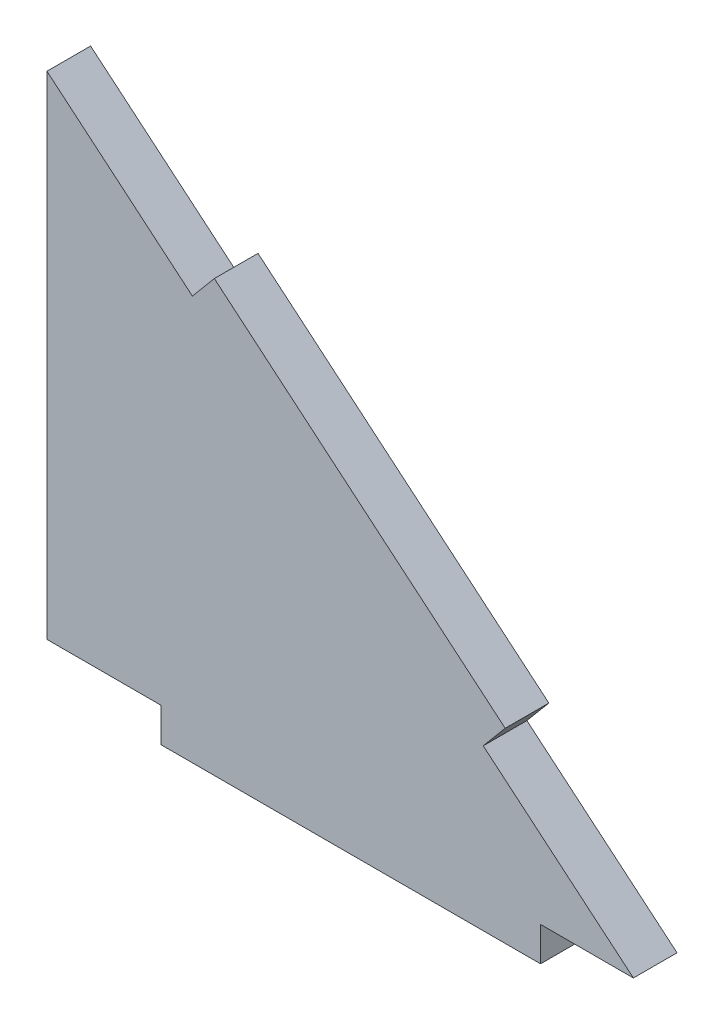
ISO-10303-21;
HEADER;
FILE_DESCRIPTION(('STEP AP214'),'2;1');
FILE_NAME('part.step','',(''),(''),'','','');
FILE_SCHEMA(('AUTOMOTIVE_DESIGN { 1 0 10303 214 1 1 1 1 }'));
ENDSEC;
DATA;
#1=APPLICATION_CONTEXT('core data for automotive mechanical design processes');
#2=APPLICATION_PROTOCOL_DEFINITION('international standard','automotive_design',2000,#1);
#3=PRODUCT_CONTEXT('',#1,'mechanical');
#4=PRODUCT('Part','Part','',(#3));
#5=PRODUCT_RELATED_PRODUCT_CATEGORY('part','',(#4));
#6=PRODUCT_DEFINITION_FORMATION('','',#4);
#7=PRODUCT_DEFINITION_CONTEXT('part definition',#1,'design');
#8=PRODUCT_DEFINITION('design','',#6,#7);
#9=PRODUCT_DEFINITION_SHAPE('','',#8);
#10=(LENGTH_UNIT() NAMED_UNIT(*) SI_UNIT(.MILLI.,.METRE.));
#11=(NAMED_UNIT(*) PLANE_ANGLE_UNIT() SI_UNIT($,.RADIAN.));
#12=(NAMED_UNIT(*) SI_UNIT($,.STERADIAN.) SOLID_ANGLE_UNIT());
#13=UNCERTAINTY_MEASURE_WITH_UNIT(LENGTH_MEASURE(1.E-05),#10,'distance_accuracy_value','');
#14=(GEOMETRIC_REPRESENTATION_CONTEXT(3) GLOBAL_UNCERTAINTY_ASSIGNED_CONTEXT((#13)) GLOBAL_UNIT_ASSIGNED_CONTEXT((#10,
#11,#12)) REPRESENTATION_CONTEXT('',''));
#15=CARTESIAN_POINT('',(0.,0.,0.));
#16=DIRECTION('',(0.,0.,1.));
#17=DIRECTION('',(1.,0.,0.));
#18=AXIS2_PLACEMENT_3D('',#15,#16,#17);
#19=CARTESIAN_POINT('',(-23.0204336081615,5.05603489528019,4.6));
#20=DIRECTION('',(0.,1.,0.));
#21=DIRECTION('',(0.,0.,1.));
#22=AXIS2_PLACEMENT_3D('',#19,#20,#21);
#23=PLANE('',#22);
#24=DIRECTION('',(1.,0.,0.));
#25=VECTOR('',#24,1.);
#26=CARTESIAN_POINT('',(-23.0204336081615,5.05603489528019,0.));
#27=LINE('',#26,#25);
#28=CARTESIAN_POINT('',(-23.0204336081615,5.05603489528019,0.));
#29=VERTEX_POINT('',#28);
#30=CARTESIAN_POINT('',(16.9795663918385,5.05603489528019,0.));
#31=VERTEX_POINT('',#30);
#32=EDGE_CURVE('E157',#29,#31,#27,.T.);
#33=ORIENTED_EDGE('',*,*,#32,.T.);
#34=DIRECTION('',(0.,0.,-1.));
#35=VECTOR('',#34,1.);
#36=CARTESIAN_POINT('',(16.9795663918385,5.05603489528019,4.6));
#37=LINE('',#36,#35);
#38=CARTESIAN_POINT('',(16.9795663918385,5.05603489528019,4.6));
#39=VERTEX_POINT('',#38);
#40=EDGE_CURVE('E11',#39,#31,#37,.T.);
#41=ORIENTED_EDGE('',*,*,#40,.F.);
#42=DIRECTION('',(1.,0.,0.));
#43=VECTOR('',#42,1.);
#44=CARTESIAN_POINT('',(-23.0204336081615,5.05603489528019,4.6));
#45=LINE('',#44,#43);
#46=CARTESIAN_POINT('',(-23.0204336081615,5.05603489528019,4.6));
#47=VERTEX_POINT('',#46);
#48=EDGE_CURVE('E178',#47,#39,#45,.T.);
#49=ORIENTED_EDGE('',*,*,#48,.F.);
#50=DIRECTION('',(0.,0.,-1.));
#51=VECTOR('',#50,1.);
#52=CARTESIAN_POINT('',(-23.0204336081615,5.05603489528019,4.6));
#53=LINE('',#52,#51);
#54=EDGE_CURVE('E153',#47,#29,#53,.T.);
#55=ORIENTED_EDGE('',*,*,#54,.T.);
#56=EDGE_LOOP('',(#33,#41,#49,#55));
#57=FACE_BOUND('',#56,.T.);
#58=ADVANCED_FACE('F43',(#57),#23,.F.);
#59=CARTESIAN_POINT('',(16.9795663918385,5.05603489528019,4.6));
#60=DIRECTION('',(-1.,0.,0.));
#61=DIRECTION('',(0.,-1.,0.));
#62=AXIS2_PLACEMENT_3D('',#59,#60,#61);
#63=PLANE('',#62);
#64=DIRECTION('',(0.,1.,0.));
#65=VECTOR('',#64,1.);
#66=CARTESIAN_POINT('',(16.9795663918385,5.05603489528019,0.));
#67=LINE('',#66,#65);
#68=CARTESIAN_POINT('',(16.9795663918387,8.65603489528019,0.));
#69=VERTEX_POINT('',#68);
#70=EDGE_CURVE('E160',#31,#69,#67,.T.);
#71=ORIENTED_EDGE('',*,*,#70,.T.);
#72=DIRECTION('',(0.,0.,-1.));
#73=VECTOR('',#72,1.);
#74=CARTESIAN_POINT('',(16.9795663918387,8.65603489528019,4.6));
#75=LINE('',#74,#73);
#76=CARTESIAN_POINT('',(16.9795663918387,8.65603489528019,4.6));
#77=VERTEX_POINT('',#76);
#78=EDGE_CURVE('E51',#77,#69,#75,.T.);
#79=ORIENTED_EDGE('',*,*,#78,.F.);
#80=DIRECTION('',(0.,1.,0.));
#81=VECTOR('',#80,1.);
#82=CARTESIAN_POINT('',(16.9795663918385,5.05603489528019,4.6));
#83=LINE('',#82,#81);
#84=EDGE_CURVE('E111',#39,#77,#83,.T.);
#85=ORIENTED_EDGE('',*,*,#84,.F.);
#86=ORIENTED_EDGE('',*,*,#40,.T.);
#87=EDGE_LOOP('',(#71,#79,#85,#86));
#88=FACE_BOUND('',#87,.T.);
#89=ADVANCED_FACE('F249',(#88),#63,.F.);
#90=CARTESIAN_POINT('',(16.9795663918387,8.65603489528019,4.6));
#91=DIRECTION('',(0.,1.,0.));
#92=DIRECTION('',(0.,0.,1.));
#93=AXIS2_PLACEMENT_3D('',#90,#91,#92);
#94=PLANE('',#93);
#95=DIRECTION('',(1.,0.,0.));
#96=VECTOR('',#95,1.);
#97=CARTESIAN_POINT('',(16.9795663918387,8.65603489528019,0.));
#98=LINE('',#97,#96);
#99=CARTESIAN_POINT('',(26.7610507293845,8.65603489528019,0.));
#100=VERTEX_POINT('',#99);
#101=EDGE_CURVE('E162',#69,#100,#98,.T.);
#102=ORIENTED_EDGE('',*,*,#101,.T.);
#103=DIRECTION('',(0.,0.,-1.));
#104=VECTOR('',#103,1.);
#105=CARTESIAN_POINT('',(26.7610507293845,8.65603489528019,4.6));
#106=LINE('',#105,#104);
#107=CARTESIAN_POINT('',(26.7610507293845,8.65603489528019,4.6));
#108=VERTEX_POINT('',#107);
#109=EDGE_CURVE('E194',#108,#100,#106,.T.);
#110=ORIENTED_EDGE('',*,*,#109,.F.);
#111=DIRECTION('',(1.,0.,0.));
#112=VECTOR('',#111,1.);
#113=CARTESIAN_POINT('',(16.9795663918387,8.65603489528019,4.6));
#114=LINE('',#113,#112);
#115=EDGE_CURVE('E202',#77,#108,#114,.T.);
#116=ORIENTED_EDGE('',*,*,#115,.F.);
#117=ORIENTED_EDGE('',*,*,#78,.T.);
#118=EDGE_LOOP('',(#102,#110,#116,#117));
#119=FACE_BOUND('',#118,.T.);
#120=ADVANCED_FACE('F200',(#119),#94,.F.);
#121=CARTESIAN_POINT('',(24.8386843202399,10.269091840181,4.6));
#122=DIRECTION('',(-0.642787609686533,-0.766044443118983,0.));
#123=DIRECTION('',(0.766044443118983,-0.642787609686533,0.));
#124=AXIS2_PLACEMENT_3D('',#121,#122,#123);
#125=PLANE('',#124);
#126=DIRECTION('',(-0.766044443118983,0.642787609686533,0.));
#127=VECTOR('',#126,1.);
#128=CARTESIAN_POINT('',(24.8386843202399,10.269091840181,0.));
#129=LINE('',#128,#127);
#130=CARTESIAN_POINT('',(10.9422329789775,21.9295990353071,0.));
#131=VERTEX_POINT('',#130);
#132=EDGE_CURVE('E165',#100,#131,#129,.T.);
#133=ORIENTED_EDGE('',*,*,#132,.T.);
#134=DIRECTION('',(0.,0.,-1.));
#135=VECTOR('',#134,1.);
#136=CARTESIAN_POINT('',(10.9422329789775,21.9295990353071,4.6));
#137=LINE('',#136,#135);
#138=CARTESIAN_POINT('',(10.9422329789775,21.9295990353071,4.6));
#139=VERTEX_POINT('',#138);
#140=EDGE_CURVE('E191',#139,#131,#137,.T.);
#141=ORIENTED_EDGE('',*,*,#140,.F.);
#142=DIRECTION('',(-0.766044443118985,0.642787609686531,0.));
#143=VECTOR('',#142,1.);
#144=CARTESIAN_POINT('',(26.7610507293845,8.65603489528019,4.6));
#145=LINE('',#144,#143);
#146=EDGE_CURVE('E219',#108,#139,#145,.T.);
#147=ORIENTED_EDGE('',*,*,#146,.F.);
#148=ORIENTED_EDGE('',*,*,#109,.T.);
#149=EDGE_LOOP('',(#133,#141,#147,#148));
#150=FACE_BOUND('',#149,.T.);
#151=ADVANCED_FACE('F210',(#150),#125,.F.);
#152=CARTESIAN_POINT('',(13.256268373849,24.6873590305354,4.6));
#153=DIRECTION('',(-0.766044443118984,0.642787609686532,0.));
#154=DIRECTION('',(-0.642787609686532,-0.766044443118984,0.));
#155=AXIS2_PLACEMENT_3D('',#152,#153,#154);
#156=PLANE('',#155);
#157=DIRECTION('',(0.642787609686532,0.766044443118984,0.));
#158=VECTOR('',#157,1.);
#159=CARTESIAN_POINT('',(13.256268373849,24.6873590305354,0.));
#160=LINE('',#159,#158);
#161=CARTESIAN_POINT('',(13.256268373849,24.6873590305354,0.));
#162=VERTEX_POINT('',#161);
#163=EDGE_CURVE('E167',#131,#162,#160,.T.);
#164=ORIENTED_EDGE('',*,*,#163,.T.);
#165=DIRECTION('',(0.,0.,-1.));
#166=VECTOR('',#165,1.);
#167=CARTESIAN_POINT('',(13.256268373849,24.6873590305354,4.6));
#168=LINE('',#167,#166);
#169=CARTESIAN_POINT('',(13.256268373849,24.6873590305354,4.6));
#170=VERTEX_POINT('',#169);
#171=EDGE_CURVE('E188',#170,#162,#168,.T.);
#172=ORIENTED_EDGE('',*,*,#171,.F.);
#173=DIRECTION('',(0.642787609686532,0.766044443118984,0.));
#174=VECTOR('',#173,1.);
#175=CARTESIAN_POINT('',(13.256268373849,24.6873590305354,4.6));
#176=LINE('',#175,#174);
#177=EDGE_CURVE('E216',#139,#170,#176,.T.);
#178=ORIENTED_EDGE('',*,*,#177,.F.);
#179=ORIENTED_EDGE('',*,*,#140,.T.);
#180=EDGE_LOOP('',(#164,#172,#178,#179));
#181=FACE_BOUND('',#180,.T.);
#182=ADVANCED_FACE('F214',(#181),#156,.F.);
#183=CARTESIAN_POINT('',(-17.3855093509103,50.3988634179968,4.6));
#184=DIRECTION('',(-0.642787609686534,-0.766044443118982,0.));
#185=DIRECTION('',(0.766044443118982,-0.642787609686534,0.));
#186=AXIS2_PLACEMENT_3D('',#183,#184,#185);
#187=PLANE('',#186);
#188=DIRECTION('',(-0.766044443118982,0.642787609686534,0.));
#189=VECTOR('',#188,1.);
#190=CARTESIAN_POINT('',(-17.3855093509103,50.3988634179968,0.));
#191=LINE('',#190,#189);
#192=CARTESIAN_POINT('',(-17.3855093509103,50.3988634179968,0.));
#193=VERTEX_POINT('',#192);
#194=EDGE_CURVE('E169',#162,#193,#191,.T.);
#195=ORIENTED_EDGE('',*,*,#194,.T.);
#196=DIRECTION('',(0.,0.,-1.));
#197=VECTOR('',#196,1.);
#198=CARTESIAN_POINT('',(-17.3855093509103,50.3988634179968,4.6));
#199=LINE('',#198,#197);
#200=CARTESIAN_POINT('',(-17.3855093509103,50.3988634179968,4.6));
#201=VERTEX_POINT('',#200);
#202=EDGE_CURVE('E185',#201,#193,#199,.T.);
#203=ORIENTED_EDGE('',*,*,#202,.F.);
#204=DIRECTION('',(-0.766044443118982,0.642787609686534,0.));
#205=VECTOR('',#204,1.);
#206=CARTESIAN_POINT('',(-17.3855093509103,50.3988634179968,4.6));
#207=LINE('',#206,#205);
#208=EDGE_CURVE('E218',#170,#201,#207,.T.);
#209=ORIENTED_EDGE('',*,*,#208,.F.);
#210=ORIENTED_EDGE('',*,*,#171,.T.);
#211=EDGE_LOOP('',(#195,#203,#209,#210));
#212=FACE_BOUND('',#211,.T.);
#213=ADVANCED_FACE('F262',(#212),#187,.F.);
#214=CARTESIAN_POINT('',(-19.6995447457818,47.6411034227684,4.6));
#215=DIRECTION('',(0.766044443118983,-0.642787609686534,0.));
#216=DIRECTION('',(0.642787609686534,0.766044443118983,0.));
#217=AXIS2_PLACEMENT_3D('',#214,#215,#216);
#218=PLANE('',#217);
#219=DIRECTION('',(-0.642787609686534,-0.766044443118983,0.));
#220=VECTOR('',#219,1.);
#221=CARTESIAN_POINT('',(-19.6995447457818,47.6411034227684,0.));
#222=LINE('',#221,#220);
#223=CARTESIAN_POINT('',(-19.6995447457818,47.6411034227684,0.));
#224=VERTEX_POINT('',#223);
#225=EDGE_CURVE('E171',#193,#224,#222,.T.);
#226=ORIENTED_EDGE('',*,*,#225,.T.);
#227=DIRECTION('',(0.,0.,-1.));
#228=VECTOR('',#227,1.);
#229=CARTESIAN_POINT('',(-19.6995447457818,47.6411034227684,4.6));
#230=LINE('',#229,#228);
#231=CARTESIAN_POINT('',(-19.6995447457818,47.6411034227684,4.6));
#232=VERTEX_POINT('',#231);
#233=EDGE_CURVE('E182',#232,#224,#230,.T.);
#234=ORIENTED_EDGE('',*,*,#233,.F.);
#235=DIRECTION('',(-0.642787609686534,-0.766044443118983,0.));
#236=VECTOR('',#235,1.);
#237=CARTESIAN_POINT('',(-19.6995447457818,47.6411034227684,4.6));
#238=LINE('',#237,#236);
#239=EDGE_CURVE('E221',#201,#232,#238,.T.);
#240=ORIENTED_EDGE('',*,*,#239,.F.);
#241=ORIENTED_EDGE('',*,*,#202,.T.);
#242=EDGE_LOOP('',(#226,#234,#240,#241));
#243=FACE_BOUND('',#242,.T.);
#244=ADVANCED_FACE('F230',(#243),#218,.F.);
#245=CARTESIAN_POINT('',(-35.0204336081615,60.4968556164993,4.6));
#246=DIRECTION('',(-0.642787609686539,-0.766044443118978,0.));
#247=DIRECTION('',(0.766044443118978,-0.642787609686539,0.));
#248=AXIS2_PLACEMENT_3D('',#245,#246,#247);
#249=PLANE('',#248);
#250=DIRECTION('',(-0.766044443118978,0.642787609686539,0.));
#251=VECTOR('',#250,1.);
#252=CARTESIAN_POINT('',(-35.0204336081615,60.4968556164993,0.));
#253=LINE('',#252,#251);
#254=CARTESIAN_POINT('',(-35.0204336081615,60.4968556164993,0.));
#255=VERTEX_POINT('',#254);
#256=EDGE_CURVE('E173',#224,#255,#253,.T.);
#257=ORIENTED_EDGE('',*,*,#256,.T.);
#258=DIRECTION('',(0.,0.,-1.));
#259=VECTOR('',#258,1.);
#260=CARTESIAN_POINT('',(-35.0204336081615,60.4968556164993,4.6));
#261=LINE('',#260,#259);
#262=CARTESIAN_POINT('',(-35.0204336081615,60.4968556164993,4.6));
#263=VERTEX_POINT('',#262);
#264=EDGE_CURVE('E148',#263,#255,#261,.T.);
#265=ORIENTED_EDGE('',*,*,#264,.F.);
#266=DIRECTION('',(-0.766044443118978,0.642787609686539,0.));
#267=VECTOR('',#266,1.);
#268=CARTESIAN_POINT('',(-35.0204336081615,60.4968556164993,4.6));
#269=LINE('',#268,#267);
#270=EDGE_CURVE('E139',#232,#263,#269,.T.);
#271=ORIENTED_EDGE('',*,*,#270,.F.);
#272=ORIENTED_EDGE('',*,*,#233,.T.);
#273=EDGE_LOOP('',(#257,#265,#271,#272));
#274=FACE_BOUND('',#273,.T.);
#275=ADVANCED_FACE('F234',(#274),#249,.F.);
#276=CARTESIAN_POINT('',(-35.0204336081615,8.65603489528019,4.6));
#277=DIRECTION('',(1.,0.,0.));
#278=DIRECTION('',(0.,0.,-1.));
#279=AXIS2_PLACEMENT_3D('',#276,#277,#278);
#280=PLANE('',#279);
#281=DIRECTION('',(0.,-1.,0.));
#282=VECTOR('',#281,1.);
#283=CARTESIAN_POINT('',(-35.0204336081615,8.65603489528019,0.));
#284=LINE('',#283,#282);
#285=CARTESIAN_POINT('',(-35.0204336081615,8.65603489528019,0.));
#286=VERTEX_POINT('',#285);
#287=EDGE_CURVE('E147',#255,#286,#284,.T.);
#288=ORIENTED_EDGE('',*,*,#287,.T.);
#289=DIRECTION('',(0.,0.,-1.));
#290=VECTOR('',#289,1.);
#291=CARTESIAN_POINT('',(-35.0204336081615,8.65603489528019,4.6));
#292=LINE('',#291,#290);
#293=CARTESIAN_POINT('',(-35.0204336081615,8.65603489528019,4.6));
#294=VERTEX_POINT('',#293);
#295=EDGE_CURVE('E144',#294,#286,#292,.T.);
#296=ORIENTED_EDGE('',*,*,#295,.F.);
#297=DIRECTION('',(0.,-1.,0.));
#298=VECTOR('',#297,1.);
#299=CARTESIAN_POINT('',(-35.0204336081615,8.65603489528019,4.6));
#300=LINE('',#299,#298);
#301=EDGE_CURVE('E133',#263,#294,#300,.T.);
#302=ORIENTED_EDGE('',*,*,#301,.F.);
#303=ORIENTED_EDGE('',*,*,#264,.T.);
#304=EDGE_LOOP('',(#288,#296,#302,#303));
#305=FACE_BOUND('',#304,.T.);
#306=ADVANCED_FACE('F145',(#305),#280,.F.);
#307=CARTESIAN_POINT('',(-23.0204336081615,8.65603489528019,4.6));
#308=DIRECTION('',(0.,1.,0.));
#309=DIRECTION('',(-1.,0.,0.));
#310=AXIS2_PLACEMENT_3D('',#307,#308,#309);
#311=PLANE('',#310);
#312=DIRECTION('',(1.,0.,0.));
#313=VECTOR('',#312,1.);
#314=CARTESIAN_POINT('',(-23.0204336081615,8.65603489528019,0.));
#315=LINE('',#314,#313);
#316=CARTESIAN_POINT('',(-23.0204336081615,8.65603489528019,0.));
#317=VERTEX_POINT('',#316);
#318=EDGE_CURVE('E97',#286,#317,#315,.T.);
#319=ORIENTED_EDGE('',*,*,#318,.T.);
#320=DIRECTION('',(0.,0.,-1.));
#321=VECTOR('',#320,1.);
#322=CARTESIAN_POINT('',(-23.0204336081615,8.65603489528019,4.6));
#323=LINE('',#322,#321);
#324=CARTESIAN_POINT('',(-23.0204336081615,8.65603489528019,4.6));
#325=VERTEX_POINT('',#324);
#326=EDGE_CURVE('E149',#325,#317,#323,.T.);
#327=ORIENTED_EDGE('',*,*,#326,.F.);
#328=DIRECTION('',(1.,0.,0.));
#329=VECTOR('',#328,1.);
#330=CARTESIAN_POINT('',(-23.0204336081615,8.65603489528019,4.6));
#331=LINE('',#330,#329);
#332=EDGE_CURVE('E137',#294,#325,#331,.T.);
#333=ORIENTED_EDGE('',*,*,#332,.F.);
#334=ORIENTED_EDGE('',*,*,#295,.T.);
#335=EDGE_LOOP('',(#319,#327,#333,#334));
#336=FACE_BOUND('',#335,.T.);
#337=ADVANCED_FACE('F151',(#336),#311,.F.);
#338=CARTESIAN_POINT('',(-23.0204336081615,5.05603489528019,4.6));
#339=DIRECTION('',(1.,0.,0.));
#340=DIRECTION('',(0.,0.,-1.));
#341=AXIS2_PLACEMENT_3D('',#338,#339,#340);
#342=PLANE('',#341);
#343=DIRECTION('',(0.,-1.,0.));
#344=VECTOR('',#343,1.);
#345=CARTESIAN_POINT('',(-23.0204336081615,5.05603489528019,0.));
#346=LINE('',#345,#344);
#347=EDGE_CURVE('E103',#317,#29,#346,.T.);
#348=ORIENTED_EDGE('',*,*,#347,.T.);
#349=ORIENTED_EDGE('',*,*,#54,.F.);
#350=DIRECTION('',(0.,-1.,0.));
#351=VECTOR('',#350,1.);
#352=CARTESIAN_POINT('',(-23.0204336081615,5.05603489528019,4.6));
#353=LINE('',#352,#351);
#354=EDGE_CURVE('E59',#325,#47,#353,.T.);
#355=ORIENTED_EDGE('',*,*,#354,.F.);
#356=ORIENTED_EDGE('',*,*,#326,.T.);
#357=EDGE_LOOP('',(#348,#349,#355,#356));
#358=FACE_BOUND('',#357,.T.);
#359=ADVANCED_FACE('F238',(#358),#342,.F.);
#360=CARTESIAN_POINT('',(0.,0.,4.6));
#361=DIRECTION('',(0.,0.,1.));
#362=DIRECTION('',(1.,0.,0.));
#363=AXIS2_PLACEMENT_3D('',#360,#361,#362);
#364=PLANE('',#363);
#365=ORIENTED_EDGE('',*,*,#48,.T.);
#366=ORIENTED_EDGE('',*,*,#84,.T.);
#367=ORIENTED_EDGE('',*,*,#115,.T.);
#368=ORIENTED_EDGE('',*,*,#146,.T.);
#369=ORIENTED_EDGE('',*,*,#177,.T.);
#370=ORIENTED_EDGE('',*,*,#208,.T.);
#371=ORIENTED_EDGE('',*,*,#239,.T.);
#372=ORIENTED_EDGE('',*,*,#270,.T.);
#373=ORIENTED_EDGE('',*,*,#301,.T.);
#374=ORIENTED_EDGE('',*,*,#332,.T.);
#375=ORIENTED_EDGE('',*,*,#354,.T.);
#376=EDGE_LOOP('',(#365,#366,#367,#368,#369,#370,#371,#372,#373,#374,#375));
#377=FACE_BOUND('',#376,.T.);
#378=ADVANCED_FACE('F135',(#377),#364,.T.);
#379=CARTESIAN_POINT('',(0.,0.,0.));
#380=DIRECTION('',(0.,0.,1.));
#381=DIRECTION('',(1.,0.,0.));
#382=AXIS2_PLACEMENT_3D('',#379,#380,#381);
#383=PLANE('',#382);
#384=ORIENTED_EDGE('',*,*,#32,.F.);
#385=ORIENTED_EDGE('',*,*,#347,.F.);
#386=ORIENTED_EDGE('',*,*,#318,.F.);
#387=ORIENTED_EDGE('',*,*,#287,.F.);
#388=ORIENTED_EDGE('',*,*,#256,.F.);
#389=ORIENTED_EDGE('',*,*,#225,.F.);
#390=ORIENTED_EDGE('',*,*,#194,.F.);
#391=ORIENTED_EDGE('',*,*,#163,.F.);
#392=ORIENTED_EDGE('',*,*,#132,.F.);
#393=ORIENTED_EDGE('',*,*,#101,.F.);
#394=ORIENTED_EDGE('',*,*,#70,.F.);
#395=EDGE_LOOP('',(#384,#385,#386,#387,#388,#389,#390,#391,#392,#393,#394));
#396=FACE_BOUND('',#395,.T.);
#397=ADVANCED_FACE('F205',(#396),#383,.F.);
#398=CLOSED_SHELL('',(#58,#89,#120,#151,#182,#213,#244,#275,#306,#337,#359,#378,#397));
#399=MANIFOLD_SOLID_BREP('B2',#398);
#400=ADVANCED_BREP_SHAPE_REPRESENTATION('',(#18,#399),#14);
#401=SHAPE_DEFINITION_REPRESENTATION(#9,#400);
ENDSEC;
END-ISO-10303-21;
